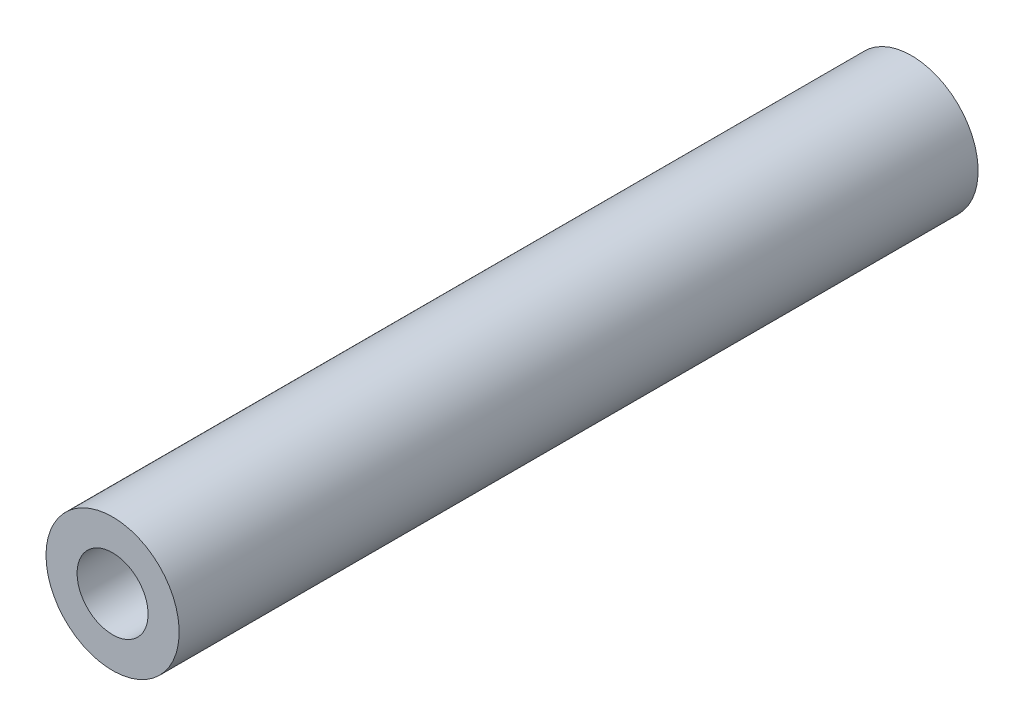
ISO-10303-21;
HEADER;
FILE_DESCRIPTION(('STEP AP214'),'2;1');
FILE_NAME('part.step','',(''),(''),'','','');
FILE_SCHEMA(('AUTOMOTIVE_DESIGN { 1 0 10303 214 1 1 1 1 }'));
ENDSEC;
DATA;
#1=APPLICATION_CONTEXT('core data for automotive mechanical design processes');
#2=APPLICATION_PROTOCOL_DEFINITION('international standard','automotive_design',2000,#1);
#3=PRODUCT_CONTEXT('',#1,'mechanical');
#4=PRODUCT('Part','Part','',(#3));
#5=PRODUCT_RELATED_PRODUCT_CATEGORY('part','',(#4));
#6=PRODUCT_DEFINITION_FORMATION('','',#4);
#7=PRODUCT_DEFINITION_CONTEXT('part definition',#1,'design');
#8=PRODUCT_DEFINITION('design','',#6,#7);
#9=PRODUCT_DEFINITION_SHAPE('','',#8);
#10=(LENGTH_UNIT() NAMED_UNIT(*) SI_UNIT(.MILLI.,.METRE.));
#11=(NAMED_UNIT(*) PLANE_ANGLE_UNIT() SI_UNIT($,.RADIAN.));
#12=(NAMED_UNIT(*) SI_UNIT($,.STERADIAN.) SOLID_ANGLE_UNIT());
#13=UNCERTAINTY_MEASURE_WITH_UNIT(LENGTH_MEASURE(1.E-05),#10,'distance_accuracy_value','');
#14=(GEOMETRIC_REPRESENTATION_CONTEXT(3) GLOBAL_UNCERTAINTY_ASSIGNED_CONTEXT((#13)) GLOBAL_UNIT_ASSIGNED_CONTEXT((#10,
#11,#12)) REPRESENTATION_CONTEXT('',''));
#15=CARTESIAN_POINT('',(0.,0.,0.));
#16=DIRECTION('',(0.,0.,1.));
#17=DIRECTION('',(1.,0.,0.));
#18=AXIS2_PLACEMENT_3D('',#15,#16,#17);
#19=CARTESIAN_POINT('',(0.,0.,180.));
#20=DIRECTION('',(0.,0.,1.));
#21=DIRECTION('',(1.,0.,0.));
#22=AXIS2_PLACEMENT_3D('',#19,#20,#21);
#23=PLANE('',#22);
#24=CARTESIAN_POINT('',(0.,0.,180.));
#25=DIRECTION('',(0.,0.,1.));
#26=DIRECTION('',(1.,0.,0.));
#27=AXIS2_PLACEMENT_3D('',#24,#25,#26);
#28=CIRCLE('',#27,15.);
#29=CARTESIAN_POINT('',(-15.,0.,180.));
#30=VERTEX_POINT('',#29);
#31=EDGE_CURVE('E10',#30,#30,#28,.T.);
#32=ORIENTED_EDGE('',*,*,#31,.T.);
#33=EDGE_LOOP('',(#32));
#34=FACE_BOUND('',#33,.T.);
#35=CARTESIAN_POINT('',(0.,0.,180.));
#36=DIRECTION('',(0.,0.,1.));
#37=DIRECTION('',(1.,0.,0.));
#38=AXIS2_PLACEMENT_3D('',#35,#36,#37);
#39=CIRCLE('',#38,8.);
#40=CARTESIAN_POINT('',(-8.,0.,180.));
#41=VERTEX_POINT('',#40);
#42=EDGE_CURVE('E52',#41,#41,#39,.T.);
#43=ORIENTED_EDGE('',*,*,#42,.F.);
#44=EDGE_LOOP('',(#43));
#45=FACE_BOUND('',#44,.T.);
#46=ADVANCED_FACE('F39',(#34,#45),#23,.T.);
#47=CARTESIAN_POINT('',(0.,0.,0.));
#48=DIRECTION('',(0.,0.,1.));
#49=DIRECTION('',(1.,0.,0.));
#50=AXIS2_PLACEMENT_3D('',#47,#48,#49);
#51=PLANE('',#50);
#52=CARTESIAN_POINT('',(0.,0.,0.));
#53=DIRECTION('',(0.,0.,1.));
#54=DIRECTION('',(1.,0.,0.));
#55=AXIS2_PLACEMENT_3D('',#52,#53,#54);
#56=CIRCLE('',#55,15.);
#57=CARTESIAN_POINT('',(-15.,0.,0.));
#58=VERTEX_POINT('',#57);
#59=EDGE_CURVE('E43',#58,#58,#56,.T.);
#60=ORIENTED_EDGE('',*,*,#59,.F.);
#61=EDGE_LOOP('',(#60));
#62=FACE_BOUND('',#61,.T.);
#63=CARTESIAN_POINT('',(0.,0.,0.));
#64=DIRECTION('',(0.,0.,1.));
#65=DIRECTION('',(1.,0.,0.));
#66=AXIS2_PLACEMENT_3D('',#63,#64,#65);
#67=CIRCLE('',#66,8.);
#68=CARTESIAN_POINT('',(-8.,0.,0.));
#69=VERTEX_POINT('',#68);
#70=EDGE_CURVE('E54',#69,#69,#67,.T.);
#71=ORIENTED_EDGE('',*,*,#70,.T.);
#72=EDGE_LOOP('',(#71));
#73=FACE_BOUND('',#72,.T.);
#74=ADVANCED_FACE('F66',(#62,#73),#51,.F.);
#75=CARTESIAN_POINT('',(0.,0.,180.));
#76=DIRECTION('',(0.,0.,-1.));
#77=DIRECTION('',(-1.,0.,0.));
#78=AXIS2_PLACEMENT_3D('',#75,#76,#77);
#79=CYLINDRICAL_SURFACE('',#78,15.);
#80=CARTESIAN_POINT('',(-15.,0.,180.));
#81=CARTESIAN_POINT('',(-15.,0.,178.125));
#82=CARTESIAN_POINT('',(-15.,0.,176.25));
#83=CARTESIAN_POINT('',(-15.,0.,172.5));
#84=CARTESIAN_POINT('',(-15.,0.,170.625));
#85=CARTESIAN_POINT('',(-15.,0.,166.875));
#86=CARTESIAN_POINT('',(-15.,0.,165.));
#87=CARTESIAN_POINT('',(-15.,0.,161.25));
#88=CARTESIAN_POINT('',(-15.,0.,159.375));
#89=CARTESIAN_POINT('',(-15.,0.,155.625));
#90=CARTESIAN_POINT('',(-15.,0.,153.75));
#91=CARTESIAN_POINT('',(-15.,0.,150.));
#92=CARTESIAN_POINT('',(-15.,0.,148.125));
#93=CARTESIAN_POINT('',(-15.,0.,144.375));
#94=CARTESIAN_POINT('',(-15.,0.,142.5));
#95=CARTESIAN_POINT('',(-15.,0.,138.75));
#96=CARTESIAN_POINT('',(-15.,0.,136.875));
#97=CARTESIAN_POINT('',(-15.,0.,133.125));
#98=CARTESIAN_POINT('',(-15.,0.,131.25));
#99=CARTESIAN_POINT('',(-15.,0.,127.5));
#100=CARTESIAN_POINT('',(-15.,0.,125.625));
#101=CARTESIAN_POINT('',(-15.,0.,121.875));
#102=CARTESIAN_POINT('',(-15.,0.,120.));
#103=CARTESIAN_POINT('',(-15.,0.,116.25));
#104=CARTESIAN_POINT('',(-15.,0.,114.375));
#105=CARTESIAN_POINT('',(-15.,0.,110.625));
#106=CARTESIAN_POINT('',(-15.,0.,108.75));
#107=CARTESIAN_POINT('',(-15.,0.,105.));
#108=CARTESIAN_POINT('',(-15.,0.,103.125));
#109=CARTESIAN_POINT('',(-15.,0.,99.375));
#110=CARTESIAN_POINT('',(-15.,0.,97.5));
#111=CARTESIAN_POINT('',(-15.,0.,93.75));
#112=CARTESIAN_POINT('',(-15.,0.,91.875));
#113=CARTESIAN_POINT('',(-15.,0.,88.125));
#114=CARTESIAN_POINT('',(-15.,0.,86.25));
#115=CARTESIAN_POINT('',(-15.,0.,82.5));
#116=CARTESIAN_POINT('',(-15.,0.,80.625));
#117=CARTESIAN_POINT('',(-15.,0.,76.875));
#118=CARTESIAN_POINT('',(-15.,0.,75.));
#119=CARTESIAN_POINT('',(-15.,0.,71.25));
#120=CARTESIAN_POINT('',(-15.,0.,69.375));
#121=CARTESIAN_POINT('',(-15.,0.,65.625));
#122=CARTESIAN_POINT('',(-15.,0.,63.75));
#123=CARTESIAN_POINT('',(-15.,0.,60.));
#124=CARTESIAN_POINT('',(-15.,0.,58.125));
#125=CARTESIAN_POINT('',(-15.,0.,54.375));
#126=CARTESIAN_POINT('',(-15.,0.,52.5));
#127=CARTESIAN_POINT('',(-15.,0.,48.75));
#128=CARTESIAN_POINT('',(-15.,0.,46.875));
#129=CARTESIAN_POINT('',(-15.,0.,43.125));
#130=CARTESIAN_POINT('',(-15.,0.,41.25));
#131=CARTESIAN_POINT('',(-15.,0.,37.5));
#132=CARTESIAN_POINT('',(-15.,0.,35.625));
#133=CARTESIAN_POINT('',(-15.,0.,31.875));
#134=CARTESIAN_POINT('',(-15.,0.,30.));
#135=CARTESIAN_POINT('',(-15.,0.,26.25));
#136=CARTESIAN_POINT('',(-15.,0.,24.375));
#137=CARTESIAN_POINT('',(-15.,0.,20.625));
#138=CARTESIAN_POINT('',(-15.,0.,18.75));
#139=CARTESIAN_POINT('',(-15.,0.,15.));
#140=CARTESIAN_POINT('',(-15.,0.,13.125));
#141=CARTESIAN_POINT('',(-15.,0.,9.37499999999998));
#142=CARTESIAN_POINT('',(-15.,0.,7.49999999999997));
#143=CARTESIAN_POINT('',(-15.,0.,3.74999999999997));
#144=CARTESIAN_POINT('',(-15.,0.,1.87499999999997));
#145=CARTESIAN_POINT('',(-15.,0.,0.));
#146=B_SPLINE_CURVE_WITH_KNOTS('',3,(#80,#81,#82,#83,#84,#85,#86,#87,#88,#89,#90,#91,#92,#93,
#94,#95,#96,#97,#98,#99,#100,#101,#102,#103,#104,#105,#106,#107,#108,#109,#110,#111,#112,#113,
#114,#115,#116,#117,#118,#119,#120,#121,#122,#123,#124,#125,#126,#127,#128,#129,#130,#131,#132,
#133,#134,#135,#136,#137,#138,#139,#140,#141,#142,#143,#144,#145),.UNSPECIFIED.,.F.,.F.,(4,2,2,
2,2,2,2,2,2,2,2,2,2,2,2,2,2,2,2,2,2,2,2,2,2,2,2,2,2,2,2,2,4),(0.,5.62499999999999,11.25,16.875,
22.5,28.125,33.75,39.375,45.,50.625,56.25,61.875,67.5,73.125,78.75,84.375,90.,95.625,101.25,
106.875,112.5,118.125,123.75,129.375,135.,140.625,146.25,151.875,157.5,163.125,168.75,174.375,
180.),.UNSPECIFIED.);
#147=EDGE_CURVE('BSEAM41',#30,#58,#146,.T.);
#148=ORIENTED_EDGE('',*,*,#31,.F.);
#149=ORIENTED_EDGE('',*,*,#59,.T.);
#150=ORIENTED_EDGE('',*,*,#147,.T.);
#151=ORIENTED_EDGE('',*,*,#147,.F.);
#152=EDGE_LOOP('',(#148,#150,#149,#151));
#153=FACE_BOUND('',#152,.T.);
#154=ADVANCED_FACE('F41',(#153),#79,.T.);
#155=CARTESIAN_POINT('',(0.,0.,180.));
#156=DIRECTION('',(0.,0.,-1.));
#157=DIRECTION('',(-1.,0.,0.));
#158=AXIS2_PLACEMENT_3D('',#155,#156,#157);
#159=CYLINDRICAL_SURFACE('',#158,8.);
#160=CARTESIAN_POINT('',(-8.,0.,180.));
#161=CARTESIAN_POINT('',(-8.,0.,178.125));
#162=CARTESIAN_POINT('',(-8.,0.,176.25));
#163=CARTESIAN_POINT('',(-8.,0.,172.5));
#164=CARTESIAN_POINT('',(-8.,0.,170.625));
#165=CARTESIAN_POINT('',(-8.,0.,166.875));
#166=CARTESIAN_POINT('',(-8.,0.,165.));
#167=CARTESIAN_POINT('',(-8.,0.,161.25));
#168=CARTESIAN_POINT('',(-8.,0.,159.375));
#169=CARTESIAN_POINT('',(-8.,0.,155.625));
#170=CARTESIAN_POINT('',(-8.,0.,153.75));
#171=CARTESIAN_POINT('',(-8.,0.,150.));
#172=CARTESIAN_POINT('',(-8.,0.,148.125));
#173=CARTESIAN_POINT('',(-8.,0.,144.375));
#174=CARTESIAN_POINT('',(-8.,0.,142.5));
#175=CARTESIAN_POINT('',(-8.,0.,138.75));
#176=CARTESIAN_POINT('',(-8.,0.,136.875));
#177=CARTESIAN_POINT('',(-8.,0.,133.125));
#178=CARTESIAN_POINT('',(-8.,0.,131.25));
#179=CARTESIAN_POINT('',(-8.,0.,127.5));
#180=CARTESIAN_POINT('',(-8.,0.,125.625));
#181=CARTESIAN_POINT('',(-8.,0.,121.875));
#182=CARTESIAN_POINT('',(-8.,0.,120.));
#183=CARTESIAN_POINT('',(-8.,0.,116.25));
#184=CARTESIAN_POINT('',(-8.,0.,114.375));
#185=CARTESIAN_POINT('',(-8.,0.,110.625));
#186=CARTESIAN_POINT('',(-8.,0.,108.75));
#187=CARTESIAN_POINT('',(-8.,0.,105.));
#188=CARTESIAN_POINT('',(-8.,0.,103.125));
#189=CARTESIAN_POINT('',(-8.,0.,99.375));
#190=CARTESIAN_POINT('',(-8.,0.,97.5));
#191=CARTESIAN_POINT('',(-8.,0.,93.75));
#192=CARTESIAN_POINT('',(-8.,0.,91.875));
#193=CARTESIAN_POINT('',(-8.,0.,88.125));
#194=CARTESIAN_POINT('',(-8.,0.,86.25));
#195=CARTESIAN_POINT('',(-8.,0.,82.5));
#196=CARTESIAN_POINT('',(-8.,0.,80.625));
#197=CARTESIAN_POINT('',(-8.,0.,76.875));
#198=CARTESIAN_POINT('',(-8.,0.,75.));
#199=CARTESIAN_POINT('',(-8.,0.,71.25));
#200=CARTESIAN_POINT('',(-8.,0.,69.375));
#201=CARTESIAN_POINT('',(-8.,0.,65.625));
#202=CARTESIAN_POINT('',(-8.,0.,63.75));
#203=CARTESIAN_POINT('',(-8.,0.,60.));
#204=CARTESIAN_POINT('',(-8.,0.,58.125));
#205=CARTESIAN_POINT('',(-8.,0.,54.375));
#206=CARTESIAN_POINT('',(-8.,0.,52.5));
#207=CARTESIAN_POINT('',(-8.,0.,48.75));
#208=CARTESIAN_POINT('',(-8.,0.,46.875));
#209=CARTESIAN_POINT('',(-8.,0.,43.125));
#210=CARTESIAN_POINT('',(-8.,0.,41.25));
#211=CARTESIAN_POINT('',(-8.,0.,37.5));
#212=CARTESIAN_POINT('',(-8.,0.,35.625));
#213=CARTESIAN_POINT('',(-8.,0.,31.875));
#214=CARTESIAN_POINT('',(-8.,0.,30.));
#215=CARTESIAN_POINT('',(-8.,0.,26.25));
#216=CARTESIAN_POINT('',(-8.,0.,24.375));
#217=CARTESIAN_POINT('',(-8.,0.,20.625));
#218=CARTESIAN_POINT('',(-8.,0.,18.75));
#219=CARTESIAN_POINT('',(-8.,0.,15.));
#220=CARTESIAN_POINT('',(-8.,0.,13.125));
#221=CARTESIAN_POINT('',(-8.,0.,9.37499999999998));
#222=CARTESIAN_POINT('',(-8.,0.,7.49999999999997));
#223=CARTESIAN_POINT('',(-8.,0.,3.74999999999997));
#224=CARTESIAN_POINT('',(-8.,0.,1.87499999999997));
#225=CARTESIAN_POINT('',(-8.,0.,0.));
#226=B_SPLINE_CURVE_WITH_KNOTS('',3,(#160,#161,#162,#163,#164,#165,#166,#167,#168,#169,#170,
#171,#172,#173,#174,#175,#176,#177,#178,#179,#180,#181,#182,#183,#184,#185,#186,#187,#188,#189,
#190,#191,#192,#193,#194,#195,#196,#197,#198,#199,#200,#201,#202,#203,#204,#205,#206,#207,#208,
#209,#210,#211,#212,#213,#214,#215,#216,#217,#218,#219,#220,#221,#222,#223,#224,#225),
.UNSPECIFIED.,.F.,.F.,(4,2,2,2,2,2,2,2,2,2,2,2,2,2,2,2,2,2,2,2,2,2,2,2,2,2,2,2,2,2,2,2,4),(0.,
5.62499999999999,11.25,16.875,22.5,28.125,33.75,39.375,45.,50.625,56.25,61.875,67.5,73.125,
78.75,84.375,90.,95.625,101.25,106.875,112.5,118.125,123.75,129.375,135.,140.625,146.25,151.875,
157.5,163.125,168.75,174.375,180.),.UNSPECIFIED.);
#227=EDGE_CURVE('BSEAM62',#41,#69,#226,.T.);
#228=ORIENTED_EDGE('',*,*,#42,.T.);
#229=ORIENTED_EDGE('',*,*,#70,.F.);
#230=ORIENTED_EDGE('',*,*,#227,.T.);
#231=ORIENTED_EDGE('',*,*,#227,.F.);
#232=EDGE_LOOP('',(#228,#230,#229,#231));
#233=FACE_BOUND('',#232,.T.);
#234=ADVANCED_FACE('F62',(#233),#159,.F.);
#235=CLOSED_SHELL('',(#46,#74,#154,#234));
#236=MANIFOLD_SOLID_BREP('B2',#235);
#237=ADVANCED_BREP_SHAPE_REPRESENTATION('',(#18,#236),#14);
#238=SHAPE_DEFINITION_REPRESENTATION(#9,#237);
ENDSEC;
END-ISO-10303-21;
